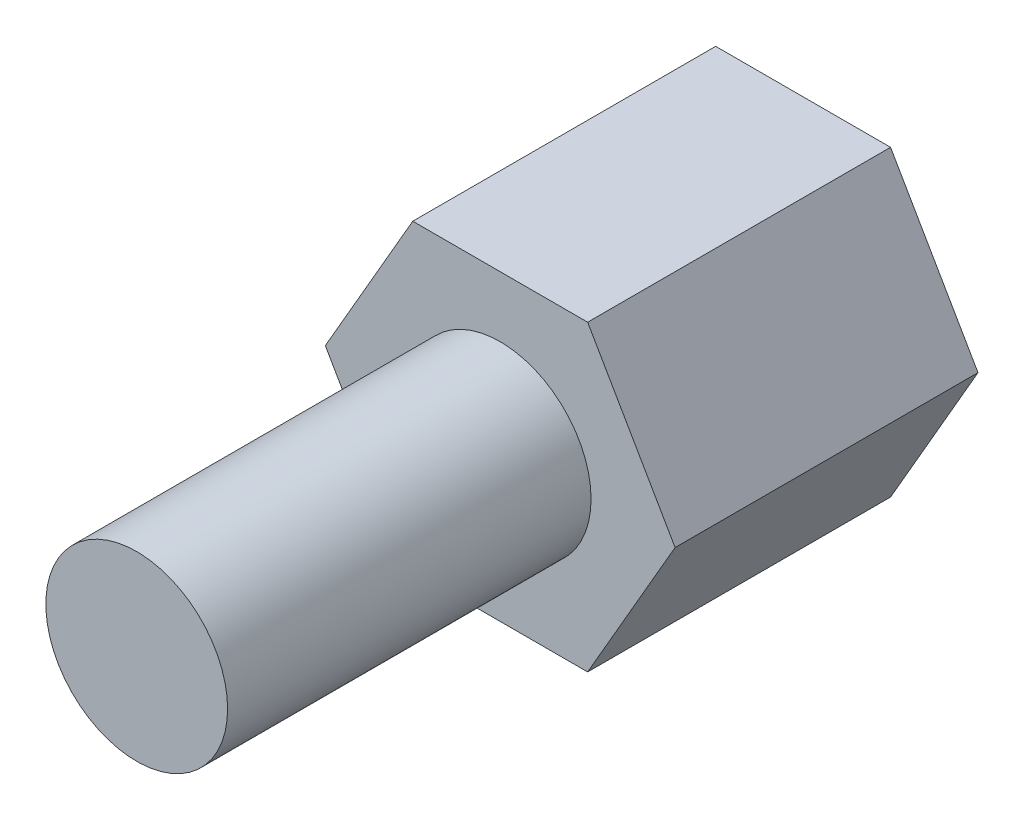
ISO-10303-21;
HEADER;
FILE_DESCRIPTION(('STEP AP214'),'2;1');
FILE_NAME('part.step','',(''),(''),'','','');
FILE_SCHEMA(('AUTOMOTIVE_DESIGN { 1 0 10303 214 1 1 1 1 }'));
ENDSEC;
DATA;
#1=APPLICATION_CONTEXT('core data for automotive mechanical design processes');
#2=APPLICATION_PROTOCOL_DEFINITION('international standard','automotive_design',2000,#1);
#3=PRODUCT_CONTEXT('',#1,'mechanical');
#4=PRODUCT('Part','Part','',(#3));
#5=PRODUCT_RELATED_PRODUCT_CATEGORY('part','',(#4));
#6=PRODUCT_DEFINITION_FORMATION('','',#4);
#7=PRODUCT_DEFINITION_CONTEXT('part definition',#1,'design');
#8=PRODUCT_DEFINITION('design','',#6,#7);
#9=PRODUCT_DEFINITION_SHAPE('','',#8);
#10=(LENGTH_UNIT() NAMED_UNIT(*) SI_UNIT(.MILLI.,.METRE.));
#11=(NAMED_UNIT(*) PLANE_ANGLE_UNIT() SI_UNIT($,.RADIAN.));
#12=(NAMED_UNIT(*) SI_UNIT($,.STERADIAN.) SOLID_ANGLE_UNIT());
#13=UNCERTAINTY_MEASURE_WITH_UNIT(LENGTH_MEASURE(1.E-05),#10,'distance_accuracy_value','');
#14=(GEOMETRIC_REPRESENTATION_CONTEXT(3) GLOBAL_UNCERTAINTY_ASSIGNED_CONTEXT((#13)) GLOBAL_UNIT_ASSIGNED_CONTEXT((#10,
#11,#12)) REPRESENTATION_CONTEXT('',''));
#15=CARTESIAN_POINT('',(0.,0.,0.));
#16=DIRECTION('',(0.,0.,1.));
#17=DIRECTION('',(1.,0.,0.));
#18=AXIS2_PLACEMENT_3D('',#15,#16,#17);
#19=CARTESIAN_POINT('',(1.44337567297406,-2.50000000000001,5.));
#20=DIRECTION('',(0.,0.,1.));
#21=DIRECTION('',(1.,0.,0.));
#22=AXIS2_PLACEMENT_3D('',#19,#20,#21);
#23=PLANE('',#22);
#24=DIRECTION('',(1.,0.,0.));
#25=VECTOR('',#24,1.);
#26=CARTESIAN_POINT('',(-1.44337567297407,-2.5,5.));
#27=LINE('',#26,#25);
#28=CARTESIAN_POINT('',(-1.44337567297407,-2.5,5.));
#29=VERTEX_POINT('',#28);
#30=CARTESIAN_POINT('',(1.44337567297406,-2.50000000000001,5.));
#31=VERTEX_POINT('',#30);
#32=EDGE_CURVE('E115',#29,#31,#27,.T.);
#33=ORIENTED_EDGE('',*,*,#32,.T.);
#34=DIRECTION('',(0.499999999999999,0.866025403784439,0.));
#35=VECTOR('',#34,1.);
#36=CARTESIAN_POINT('',(1.44337567297406,-2.50000000000001,5.));
#37=LINE('',#36,#35);
#38=CARTESIAN_POINT('',(2.88675134594814,0.,5.));
#39=VERTEX_POINT('',#38);
#40=EDGE_CURVE('E117',#31,#39,#37,.T.);
#41=ORIENTED_EDGE('',*,*,#40,.T.);
#42=DIRECTION('',(-0.5,0.866025403784439,0.));
#43=VECTOR('',#42,1.);
#44=CARTESIAN_POINT('',(2.88675134594814,0.,5.));
#45=LINE('',#44,#43);
#46=CARTESIAN_POINT('',(1.44337567297407,2.50000000000002,5.));
#47=VERTEX_POINT('',#46);
#48=EDGE_CURVE('E119',#39,#47,#45,.T.);
#49=ORIENTED_EDGE('',*,*,#48,.T.);
#50=DIRECTION('',(-1.,0.,0.));
#51=VECTOR('',#50,1.);
#52=CARTESIAN_POINT('',(1.44337567297407,2.50000000000002,5.));
#53=LINE('',#52,#51);
#54=CARTESIAN_POINT('',(-1.44337567297407,2.50000000000002,5.));
#55=VERTEX_POINT('',#54);
#56=EDGE_CURVE('E121',#47,#55,#53,.T.);
#57=ORIENTED_EDGE('',*,*,#56,.T.);
#58=DIRECTION('',(-0.500000000000001,-0.866025403784438,0.));
#59=VECTOR('',#58,1.);
#60=CARTESIAN_POINT('',(-1.44337567297407,2.50000000000002,5.));
#61=LINE('',#60,#59);
#62=CARTESIAN_POINT('',(-2.88675134594814,0.,5.));
#63=VERTEX_POINT('',#62);
#64=EDGE_CURVE('E48',#55,#63,#61,.T.);
#65=ORIENTED_EDGE('',*,*,#64,.T.);
#66=DIRECTION('',(0.5,-0.866025403784439,0.));
#67=VECTOR('',#66,1.);
#68=CARTESIAN_POINT('',(-2.88675134594814,0.,5.));
#69=LINE('',#68,#67);
#70=EDGE_CURVE('E43',#63,#29,#69,.T.);
#71=ORIENTED_EDGE('',*,*,#70,.T.);
#72=EDGE_LOOP('',(#33,#41,#49,#57,#65,#71));
#73=FACE_BOUND('',#72,.T.);
#74=CARTESIAN_POINT('',(0.,0.,5.));
#75=DIRECTION('',(0.,0.,1.));
#76=DIRECTION('',(1.,0.,0.));
#77=AXIS2_PLACEMENT_3D('',#74,#75,#76);
#78=CIRCLE('',#77,1.5);
#79=CARTESIAN_POINT('',(1.5,0.,5.));
#80=VERTEX_POINT('',#79);
#81=EDGE_CURVE('E94',#80,#80,#78,.T.);
#82=ORIENTED_EDGE('',*,*,#81,.F.);
#83=EDGE_LOOP('',(#82));
#84=FACE_BOUND('',#83,.T.);
#85=ADVANCED_FACE('F28',(#73,#84),#23,.T.);
#86=CARTESIAN_POINT('',(-1.44337567297407,-2.5,5.));
#87=DIRECTION('',(0.,1.,0.));
#88=DIRECTION('',(-1.,0.,0.));
#89=AXIS2_PLACEMENT_3D('',#86,#87,#88);
#90=PLANE('',#89);
#91=DIRECTION('',(1.,0.,0.));
#92=VECTOR('',#91,1.);
#93=CARTESIAN_POINT('',(-1.44337567297407,-2.5,0.));
#94=LINE('',#93,#92);
#95=CARTESIAN_POINT('',(-1.44337567297407,-2.5,0.));
#96=VERTEX_POINT('',#95);
#97=CARTESIAN_POINT('',(1.44337567297406,-2.50000000000001,0.));
#98=VERTEX_POINT('',#97);
#99=EDGE_CURVE('E102',#96,#98,#94,.T.);
#100=ORIENTED_EDGE('',*,*,#99,.T.);
#101=DIRECTION('',(0.,0.,-1.));
#102=VECTOR('',#101,1.);
#103=CARTESIAN_POINT('',(1.44337567297406,-2.50000000000001,5.));
#104=LINE('',#103,#102);
#105=EDGE_CURVE('E11',#31,#98,#104,.T.);
#106=ORIENTED_EDGE('',*,*,#105,.F.);
#107=ORIENTED_EDGE('',*,*,#32,.F.);
#108=DIRECTION('',(0.,0.,-1.));
#109=VECTOR('',#108,1.);
#110=CARTESIAN_POINT('',(-1.44337567297407,-2.5,5.));
#111=LINE('',#110,#109);
#112=EDGE_CURVE('E125',#29,#96,#111,.T.);
#113=ORIENTED_EDGE('',*,*,#112,.T.);
#114=EDGE_LOOP('',(#100,#106,#107,#113));
#115=FACE_BOUND('',#114,.T.);
#116=ADVANCED_FACE('F30',(#115),#90,.F.);
#117=CARTESIAN_POINT('',(1.44337567297406,-2.50000000000001,5.));
#118=DIRECTION('',(-0.866025403784439,0.499999999999999,0.));
#119=DIRECTION('',(-0.499999999999999,-0.866025403784439,0.));
#120=AXIS2_PLACEMENT_3D('',#117,#118,#119);
#121=PLANE('',#120);
#122=DIRECTION('',(0.499999999999999,0.866025403784439,0.));
#123=VECTOR('',#122,1.);
#124=CARTESIAN_POINT('',(1.44337567297406,-2.50000000000001,0.));
#125=LINE('',#124,#123);
#126=CARTESIAN_POINT('',(2.88675134594814,0.,0.));
#127=VERTEX_POINT('',#126);
#128=EDGE_CURVE('E105',#98,#127,#125,.T.);
#129=ORIENTED_EDGE('',*,*,#128,.T.);
#130=DIRECTION('',(0.,0.,-1.));
#131=VECTOR('',#130,1.);
#132=CARTESIAN_POINT('',(2.88675134594814,0.,5.));
#133=LINE('',#132,#131);
#134=EDGE_CURVE('E36',#39,#127,#133,.T.);
#135=ORIENTED_EDGE('',*,*,#134,.F.);
#136=ORIENTED_EDGE('',*,*,#40,.F.);
#137=ORIENTED_EDGE('',*,*,#105,.T.);
#138=EDGE_LOOP('',(#129,#135,#136,#137));
#139=FACE_BOUND('',#138,.T.);
#140=ADVANCED_FACE('F162',(#139),#121,.F.);
#141=CARTESIAN_POINT('',(2.88675134594814,0.,5.));
#142=DIRECTION('',(-0.866025403784439,-0.5,0.));
#143=DIRECTION('',(0.5,-0.866025403784439,0.));
#144=AXIS2_PLACEMENT_3D('',#141,#142,#143);
#145=PLANE('',#144);
#146=DIRECTION('',(-0.5,0.866025403784439,0.));
#147=VECTOR('',#146,1.);
#148=CARTESIAN_POINT('',(2.88675134594814,0.,0.));
#149=LINE('',#148,#147);
#150=CARTESIAN_POINT('',(1.44337567297407,2.50000000000002,0.));
#151=VERTEX_POINT('',#150);
#152=EDGE_CURVE('E107',#127,#151,#149,.T.);
#153=ORIENTED_EDGE('',*,*,#152,.T.);
#154=DIRECTION('',(0.,0.,-1.));
#155=VECTOR('',#154,1.);
#156=CARTESIAN_POINT('',(1.44337567297407,2.50000000000002,5.));
#157=LINE('',#156,#155);
#158=EDGE_CURVE('E134',#47,#151,#157,.T.);
#159=ORIENTED_EDGE('',*,*,#158,.F.);
#160=ORIENTED_EDGE('',*,*,#48,.F.);
#161=ORIENTED_EDGE('',*,*,#134,.T.);
#162=EDGE_LOOP('',(#153,#159,#160,#161));
#163=FACE_BOUND('',#162,.T.);
#164=ADVANCED_FACE('F141',(#163),#145,.F.);
#165=CARTESIAN_POINT('',(1.44337567297407,2.50000000000002,5.));
#166=DIRECTION('',(0.,-1.,0.));
#167=DIRECTION('',(1.,0.,0.));
#168=AXIS2_PLACEMENT_3D('',#165,#166,#167);
#169=PLANE('',#168);
#170=DIRECTION('',(-1.,0.,0.));
#171=VECTOR('',#170,1.);
#172=CARTESIAN_POINT('',(1.44337567297407,2.50000000000002,0.));
#173=LINE('',#172,#171);
#174=CARTESIAN_POINT('',(-1.44337567297407,2.50000000000002,0.));
#175=VERTEX_POINT('',#174);
#176=EDGE_CURVE('E109',#151,#175,#173,.T.);
#177=ORIENTED_EDGE('',*,*,#176,.T.);
#178=DIRECTION('',(0.,0.,-1.));
#179=VECTOR('',#178,1.);
#180=CARTESIAN_POINT('',(-1.44337567297407,2.50000000000002,5.));
#181=LINE('',#180,#179);
#182=EDGE_CURVE('E131',#55,#175,#181,.T.);
#183=ORIENTED_EDGE('',*,*,#182,.F.);
#184=ORIENTED_EDGE('',*,*,#56,.F.);
#185=ORIENTED_EDGE('',*,*,#158,.T.);
#186=EDGE_LOOP('',(#177,#183,#184,#185));
#187=FACE_BOUND('',#186,.T.);
#188=ADVANCED_FACE('F152',(#187),#169,.F.);
#189=CARTESIAN_POINT('',(-1.44337567297407,2.50000000000002,5.));
#190=DIRECTION('',(0.866025403784438,-0.500000000000001,0.));
#191=DIRECTION('',(0.500000000000001,0.866025403784438,0.));
#192=AXIS2_PLACEMENT_3D('',#189,#190,#191);
#193=PLANE('',#192);
#194=DIRECTION('',(-0.500000000000001,-0.866025403784438,0.));
#195=VECTOR('',#194,1.);
#196=CARTESIAN_POINT('',(-1.44337567297407,2.50000000000002,0.));
#197=LINE('',#196,#195);
#198=CARTESIAN_POINT('',(-2.88675134594814,0.,0.));
#199=VERTEX_POINT('',#198);
#200=EDGE_CURVE('E111',#175,#199,#197,.T.);
#201=ORIENTED_EDGE('',*,*,#200,.T.);
#202=DIRECTION('',(0.,0.,-1.));
#203=VECTOR('',#202,1.);
#204=CARTESIAN_POINT('',(-2.88675134594814,0.,5.));
#205=LINE('',#204,#203);
#206=EDGE_CURVE('E128',#63,#199,#205,.T.);
#207=ORIENTED_EDGE('',*,*,#206,.F.);
#208=ORIENTED_EDGE('',*,*,#64,.F.);
#209=ORIENTED_EDGE('',*,*,#182,.T.);
#210=EDGE_LOOP('',(#201,#207,#208,#209));
#211=FACE_BOUND('',#210,.T.);
#212=ADVANCED_FACE('F155',(#211),#193,.F.);
#213=CARTESIAN_POINT('',(-2.88675134594814,0.,5.));
#214=DIRECTION('',(0.866025403784439,0.5,0.));
#215=DIRECTION('',(-0.5,0.866025403784439,0.));
#216=AXIS2_PLACEMENT_3D('',#213,#214,#215);
#217=PLANE('',#216);
#218=DIRECTION('',(0.5,-0.866025403784439,0.));
#219=VECTOR('',#218,1.);
#220=CARTESIAN_POINT('',(-2.88675134594814,0.,0.));
#221=LINE('',#220,#219);
#222=EDGE_CURVE('E113',#199,#96,#221,.T.);
#223=ORIENTED_EDGE('',*,*,#222,.T.);
#224=ORIENTED_EDGE('',*,*,#112,.F.);
#225=ORIENTED_EDGE('',*,*,#70,.F.);
#226=ORIENTED_EDGE('',*,*,#206,.T.);
#227=EDGE_LOOP('',(#223,#224,#225,#226));
#228=FACE_BOUND('',#227,.T.);
#229=ADVANCED_FACE('F157',(#228),#217,.F.);
#230=CARTESIAN_POINT('',(1.44337567297406,-2.50000000000001,0.));
#231=DIRECTION('',(0.,0.,1.));
#232=DIRECTION('',(1.,0.,0.));
#233=AXIS2_PLACEMENT_3D('',#230,#231,#232);
#234=PLANE('',#233);
#235=CARTESIAN_POINT('',(0.,0.,0.));
#236=DIRECTION('',(0.,0.,-1.));
#237=DIRECTION('',(-1.,0.,0.));
#238=AXIS2_PLACEMENT_3D('',#235,#236,#237);
#239=CIRCLE('',#238,1.24999999999999);
#240=CARTESIAN_POINT('',(-1.24999999999999,0.,0.));
#241=VERTEX_POINT('',#240);
#242=EDGE_CURVE('E91',#241,#241,#239,.T.);
#243=ORIENTED_EDGE('',*,*,#242,.F.);
#244=EDGE_LOOP('',(#243));
#245=FACE_BOUND('',#244,.T.);
#246=ORIENTED_EDGE('',*,*,#99,.F.);
#247=ORIENTED_EDGE('',*,*,#222,.F.);
#248=ORIENTED_EDGE('',*,*,#200,.F.);
#249=ORIENTED_EDGE('',*,*,#176,.F.);
#250=ORIENTED_EDGE('',*,*,#152,.F.);
#251=ORIENTED_EDGE('',*,*,#128,.F.);
#252=EDGE_LOOP('',(#246,#247,#248,#249,#250,#251));
#253=FACE_BOUND('',#252,.T.);
#254=ADVANCED_FACE('F147',(#245,#253),#234,.F.);
#255=CARTESIAN_POINT('',(0.,0.,11.));
#256=DIRECTION('',(0.,0.,-1.));
#257=DIRECTION('',(-1.,0.,0.));
#258=AXIS2_PLACEMENT_3D('',#255,#256,#257);
#259=CYLINDRICAL_SURFACE('',#258,1.5);
#260=CARTESIAN_POINT('',(0.,0.,11.));
#261=DIRECTION('',(0.,0.,1.));
#262=DIRECTION('',(1.,0.,0.));
#263=AXIS2_PLACEMENT_3D('',#260,#261,#262);
#264=CIRCLE('',#263,1.5);
#265=CARTESIAN_POINT('',(1.5,0.,11.));
#266=VERTEX_POINT('',#265);
#267=EDGE_CURVE('E99',#266,#266,#264,.T.);
#268=ORIENTED_EDGE('',*,*,#267,.F.);
#269=EDGE_LOOP('',(#268));
#270=FACE_BOUND('',#269,.T.);
#271=ORIENTED_EDGE('',*,*,#81,.T.);
#272=EDGE_LOOP('',(#271));
#273=FACE_BOUND('',#272,.T.);
#274=ADVANCED_FACE('F200',(#270,#273),#259,.T.);
#275=CARTESIAN_POINT('',(0.,0.,11.));
#276=DIRECTION('',(0.,0.,1.));
#277=DIRECTION('',(1.,0.,0.));
#278=AXIS2_PLACEMENT_3D('',#275,#276,#277);
#279=PLANE('',#278);
#280=ORIENTED_EDGE('',*,*,#267,.T.);
#281=EDGE_LOOP('',(#280));
#282=FACE_BOUND('',#281,.T.);
#283=ADVANCED_FACE('F211',(#282),#279,.T.);
#284=CARTESIAN_POINT('',(0.,0.,0.));
#285=DIRECTION('',(0.,0.,-1.));
#286=DIRECTION('',(-1.,0.,0.));
#287=AXIS2_PLACEMENT_3D('',#284,#285,#286);
#288=CYLINDRICAL_SURFACE('',#287,1.24999999999999);
#289=CARTESIAN_POINT('',(0.,0.,6.5));
#290=DIRECTION('',(0.,0.,-1.));
#291=DIRECTION('',(-1.,0.,0.));
#292=AXIS2_PLACEMENT_3D('',#289,#290,#291);
#293=CIRCLE('',#292,1.25);
#294=CARTESIAN_POINT('',(-1.25,0.,6.5));
#295=VERTEX_POINT('',#294);
#296=EDGE_CURVE('E89',#295,#295,#293,.T.);
#297=ORIENTED_EDGE('',*,*,#296,.F.);
#298=EDGE_LOOP('',(#297));
#299=FACE_BOUND('',#298,.T.);
#300=ORIENTED_EDGE('',*,*,#242,.T.);
#301=EDGE_LOOP('',(#300));
#302=FACE_BOUND('',#301,.T.);
#303=ADVANCED_FACE('F85',(#299,#302),#288,.F.);
#304=CARTESIAN_POINT('',(0.,0.,6.5));
#305=DIRECTION('',(0.,0.,-1.));
#306=DIRECTION('',(-1.,0.,0.));
#307=AXIS2_PLACEMENT_3D('',#304,#305,#306);
#308=CONICAL_SURFACE('',#307,1.25,1.02974425867665);
#309=CARTESIAN_POINT('',(0.,0.,7.25107577378445));
#310=VERTEX_POINT('',#309);
#311=VERTEX_LOOP('',#310);
#312=FACE_BOUND('',#311,.T.);
#313=ORIENTED_EDGE('',*,*,#296,.T.);
#314=EDGE_LOOP('',(#313));
#315=FACE_BOUND('',#314,.T.);
#316=ADVANCED_FACE('F82',(#312,#315),#308,.F.);
#317=CLOSED_SHELL('',(#85,#116,#140,#164,#188,#212,#229,#254,#274,#283,#303,#316));
#318=MANIFOLD_SOLID_BREP('B2',#317);
#319=ADVANCED_BREP_SHAPE_REPRESENTATION('',(#18,#318),#14);
#320=SHAPE_DEFINITION_REPRESENTATION(#9,#319);
ENDSEC;
END-ISO-10303-21;
